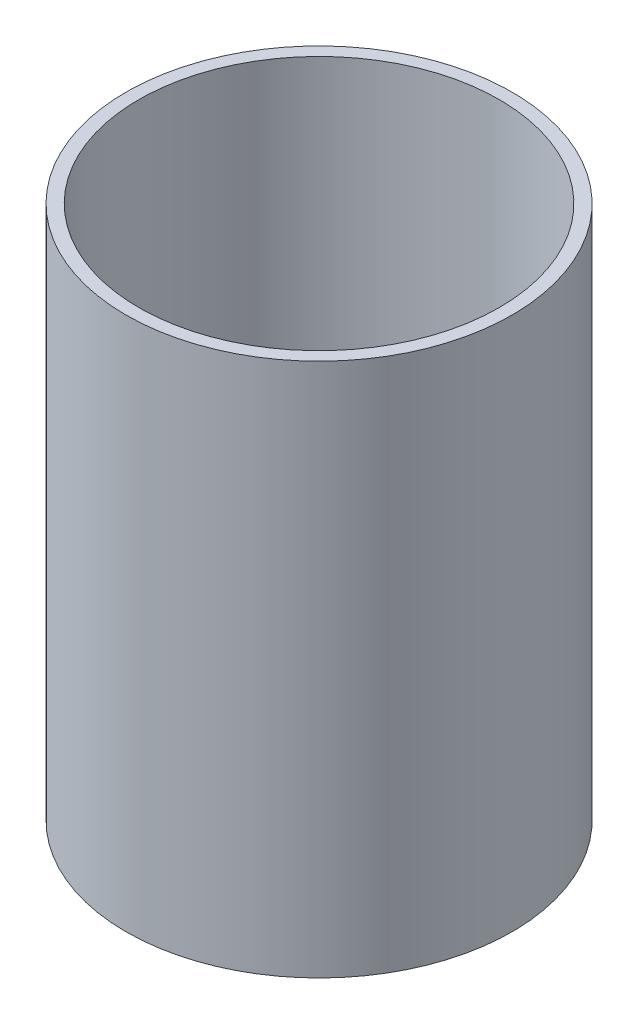
ISO-10303-21;
HEADER;
FILE_DESCRIPTION(('STEP AP214'),'2;1');
FILE_NAME('part.step','',(''),(''),'','','');
FILE_SCHEMA(('AUTOMOTIVE_DESIGN { 1 0 10303 214 1 1 1 1 }'));
ENDSEC;
DATA;
#1=APPLICATION_CONTEXT('core data for automotive mechanical design processes');
#2=APPLICATION_PROTOCOL_DEFINITION('international standard','automotive_design',2000,#1);
#3=PRODUCT_CONTEXT('',#1,'mechanical');
#4=PRODUCT('Part','Part','',(#3));
#5=PRODUCT_RELATED_PRODUCT_CATEGORY('part','',(#4));
#6=PRODUCT_DEFINITION_FORMATION('','',#4);
#7=PRODUCT_DEFINITION_CONTEXT('part definition',#1,'design');
#8=PRODUCT_DEFINITION('design','',#6,#7);
#9=PRODUCT_DEFINITION_SHAPE('','',#8);
#10=(LENGTH_UNIT() NAMED_UNIT(*) SI_UNIT(.MILLI.,.METRE.));
#11=(NAMED_UNIT(*) PLANE_ANGLE_UNIT() SI_UNIT($,.RADIAN.));
#12=(NAMED_UNIT(*) SI_UNIT($,.STERADIAN.) SOLID_ANGLE_UNIT());
#13=UNCERTAINTY_MEASURE_WITH_UNIT(LENGTH_MEASURE(1.E-05),#10,'distance_accuracy_value','');
#14=(GEOMETRIC_REPRESENTATION_CONTEXT(3) GLOBAL_UNCERTAINTY_ASSIGNED_CONTEXT((#13)) GLOBAL_UNIT_ASSIGNED_CONTEXT((#10,
#11,#12)) REPRESENTATION_CONTEXT('',''));
#15=CARTESIAN_POINT('',(0.,0.,0.));
#16=DIRECTION('',(0.,0.,1.));
#17=DIRECTION('',(1.,0.,0.));
#18=AXIS2_PLACEMENT_3D('',#15,#16,#17);
#19=CARTESIAN_POINT('',(0.,3.,0.));
#20=DIRECTION('',(0.,-1.,0.));
#21=DIRECTION('',(0.,0.,-1.));
#22=AXIS2_PLACEMENT_3D('',#19,#20,#21);
#23=CYLINDRICAL_SURFACE('',#22,30.);
#24=CARTESIAN_POINT('',(0.,0.,0.));
#25=DIRECTION('',(0.,1.,0.));
#26=DIRECTION('',(0.,0.,1.));
#27=AXIS2_PLACEMENT_3D('',#24,#25,#26);
#28=CIRCLE('',#27,30.);
#29=CARTESIAN_POINT('',(0.,0.,30.));
#30=VERTEX_POINT('',#29);
#31=EDGE_CURVE('E11',#30,#30,#28,.T.);
#32=ORIENTED_EDGE('',*,*,#31,.T.);
#33=EDGE_LOOP('',(#32));
#34=FACE_BOUND('',#33,.T.);
#35=CARTESIAN_POINT('',(0.,83.,0.));
#36=DIRECTION('',(0.,1.,0.));
#37=DIRECTION('',(0.,0.,1.));
#38=AXIS2_PLACEMENT_3D('',#35,#36,#37);
#39=CIRCLE('',#38,30.);
#40=CARTESIAN_POINT('',(0.,83.,30.));
#41=VERTEX_POINT('',#40);
#42=EDGE_CURVE('E51',#41,#41,#39,.T.);
#43=ORIENTED_EDGE('',*,*,#42,.F.);
#44=EDGE_LOOP('',(#43));
#45=FACE_BOUND('',#44,.T.);
#46=ADVANCED_FACE('F44',(#34,#45),#23,.T.);
#47=CARTESIAN_POINT('',(0.,0.,0.));
#48=DIRECTION('',(0.,1.,0.));
#49=DIRECTION('',(0.,0.,1.));
#50=AXIS2_PLACEMENT_3D('',#47,#48,#49);
#51=PLANE('',#50);
#52=ORIENTED_EDGE('',*,*,#31,.F.);
#53=EDGE_LOOP('',(#52));
#54=FACE_BOUND('',#53,.T.);
#55=ADVANCED_FACE('F79',(#54),#51,.F.);
#56=CARTESIAN_POINT('',(0.,83.,0.));
#57=DIRECTION('',(0.,1.,0.));
#58=DIRECTION('',(0.,0.,1.));
#59=AXIS2_PLACEMENT_3D('',#56,#57,#58);
#60=PLANE('',#59);
#61=ORIENTED_EDGE('',*,*,#42,.T.);
#62=EDGE_LOOP('',(#61));
#63=FACE_BOUND('',#62,.T.);
#64=CARTESIAN_POINT('',(0.,83.,0.));
#65=DIRECTION('',(0.,1.,0.));
#66=DIRECTION('',(1.,0.,0.));
#67=AXIS2_PLACEMENT_3D('',#64,#65,#66);
#68=CIRCLE('',#67,28.);
#69=CARTESIAN_POINT('',(28.,83.,0.));
#70=VERTEX_POINT('',#69);
#71=EDGE_CURVE('E54',#70,#70,#68,.T.);
#72=ORIENTED_EDGE('',*,*,#71,.F.);
#73=EDGE_LOOP('',(#72));
#74=FACE_BOUND('',#73,.T.);
#75=ADVANCED_FACE('F67',(#63,#74),#60,.T.);
#76=CARTESIAN_POINT('',(0.,83.,0.));
#77=DIRECTION('',(0.,-1.,0.));
#78=DIRECTION('',(0.,0.,-1.));
#79=AXIS2_PLACEMENT_3D('',#76,#77,#78);
#80=CYLINDRICAL_SURFACE('',#79,28.);
#81=ORIENTED_EDGE('',*,*,#71,.T.);
#82=EDGE_LOOP('',(#81));
#83=FACE_BOUND('',#82,.T.);
#84=CARTESIAN_POINT('',(0.,3.,0.));
#85=DIRECTION('',(0.,1.,0.));
#86=DIRECTION('',(1.,0.,0.));
#87=AXIS2_PLACEMENT_3D('',#84,#85,#86);
#88=CIRCLE('',#87,28.);
#89=CARTESIAN_POINT('',(28.,3.,0.));
#90=VERTEX_POINT('',#89);
#91=EDGE_CURVE('E56',#90,#90,#88,.T.);
#92=ORIENTED_EDGE('',*,*,#91,.F.);
#93=EDGE_LOOP('',(#92));
#94=FACE_BOUND('',#93,.T.);
#95=ADVANCED_FACE('F70',(#83,#94),#80,.F.);
#96=CARTESIAN_POINT('',(0.,3.,0.));
#97=DIRECTION('',(0.,1.,0.));
#98=DIRECTION('',(0.,0.,1.));
#99=AXIS2_PLACEMENT_3D('',#96,#97,#98);
#100=PLANE('',#99);
#101=ORIENTED_EDGE('',*,*,#91,.T.);
#102=EDGE_LOOP('',(#101));
#103=FACE_BOUND('',#102,.T.);
#104=ADVANCED_FACE('F61',(#103),#100,.T.);
#105=CLOSED_SHELL('',(#46,#55,#75,#95,#104));
#106=MANIFOLD_SOLID_BREP('B2',#105);
#107=ADVANCED_BREP_SHAPE_REPRESENTATION('',(#18,#106),#14);
#108=SHAPE_DEFINITION_REPRESENTATION(#9,#107);
ENDSEC;
END-ISO-10303-21;
